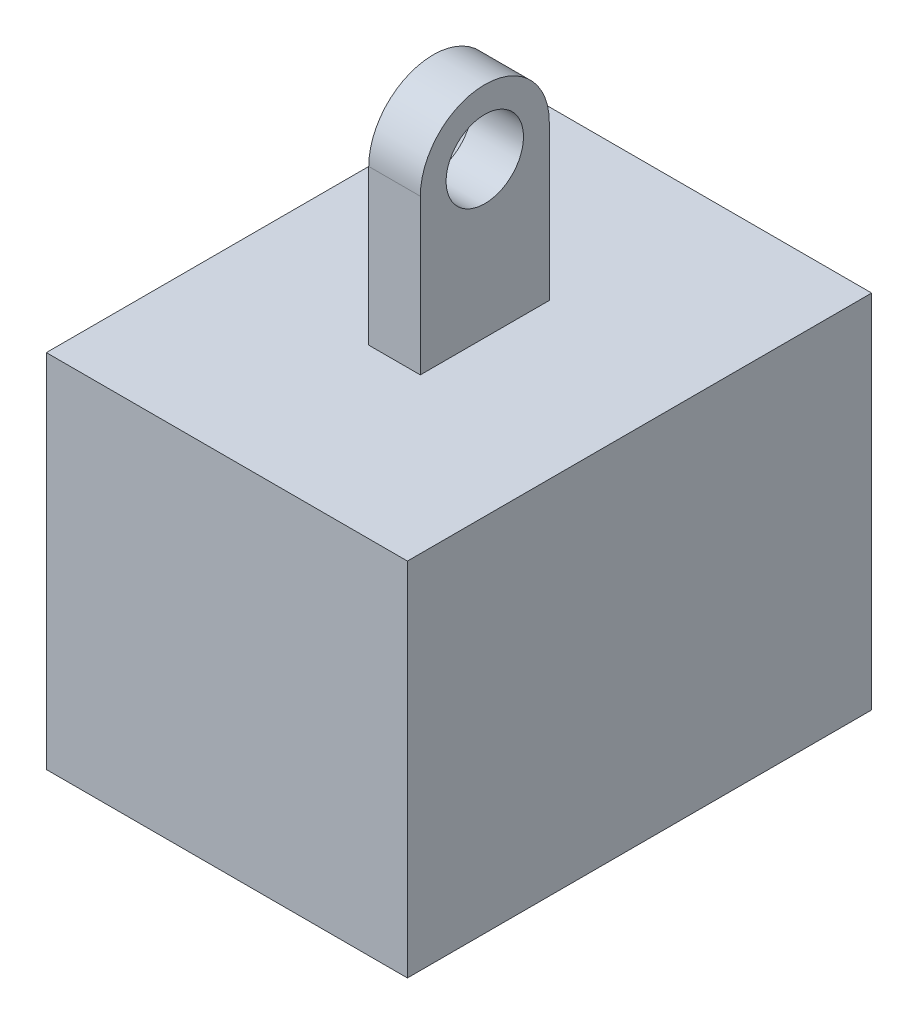
ISO-10303-21;
HEADER;
FILE_DESCRIPTION(('STEP AP214'),'2;1');
FILE_NAME('part.step','',(''),(''),'','','');
FILE_SCHEMA(('AUTOMOTIVE_DESIGN { 1 0 10303 214 1 1 1 1 }'));
ENDSEC;
DATA;
#1=APPLICATION_CONTEXT('core data for automotive mechanical design processes');
#2=APPLICATION_PROTOCOL_DEFINITION('international standard','automotive_design',2000,#1);
#3=PRODUCT_CONTEXT('',#1,'mechanical');
#4=PRODUCT('Part','Part','',(#3));
#5=PRODUCT_RELATED_PRODUCT_CATEGORY('part','',(#4));
#6=PRODUCT_DEFINITION_FORMATION('','',#4);
#7=PRODUCT_DEFINITION_CONTEXT('part definition',#1,'design');
#8=PRODUCT_DEFINITION('design','',#6,#7);
#9=PRODUCT_DEFINITION_SHAPE('','',#8);
#10=(LENGTH_UNIT() NAMED_UNIT(*) SI_UNIT(.MILLI.,.METRE.));
#11=(NAMED_UNIT(*) PLANE_ANGLE_UNIT() SI_UNIT($,.RADIAN.));
#12=(NAMED_UNIT(*) SI_UNIT($,.STERADIAN.) SOLID_ANGLE_UNIT());
#13=UNCERTAINTY_MEASURE_WITH_UNIT(LENGTH_MEASURE(1.E-05),#10,'distance_accuracy_value','');
#14=(GEOMETRIC_REPRESENTATION_CONTEXT(3) GLOBAL_UNCERTAINTY_ASSIGNED_CONTEXT((#13)) GLOBAL_UNIT_ASSIGNED_CONTEXT((#10,
#11,#12)) REPRESENTATION_CONTEXT('',''));
#15=CARTESIAN_POINT('',(0.,0.,0.));
#16=DIRECTION('',(0.,0.,1.));
#17=DIRECTION('',(1.,0.,0.));
#18=AXIS2_PLACEMENT_3D('',#15,#16,#17);
#19=CARTESIAN_POINT('',(35.,35.,90.));
#20=DIRECTION('',(-1.,0.,0.));
#21=DIRECTION('',(0.,-1.,0.));
#22=AXIS2_PLACEMENT_3D('',#19,#20,#21);
#23=PLANE('',#22);
#24=DIRECTION('',(0.,1.,0.));
#25=VECTOR('',#24,1.);
#26=CARTESIAN_POINT('',(35.,35.,0.));
#27=LINE('',#26,#25);
#28=CARTESIAN_POINT('',(35.,-35.,0.));
#29=VERTEX_POINT('',#28);
#30=CARTESIAN_POINT('',(35.,35.,0.));
#31=VERTEX_POINT('',#30);
#32=EDGE_CURVE('E138',#29,#31,#27,.T.);
#33=ORIENTED_EDGE('',*,*,#32,.T.);
#34=DIRECTION('',(0.,0.,-1.));
#35=VECTOR('',#34,1.);
#36=CARTESIAN_POINT('',(35.,35.,90.));
#37=LINE('',#36,#35);
#38=CARTESIAN_POINT('',(35.,35.,90.));
#39=VERTEX_POINT('',#38);
#40=EDGE_CURVE('E11',#39,#31,#37,.T.);
#41=ORIENTED_EDGE('',*,*,#40,.F.);
#42=DIRECTION('',(0.,1.,0.));
#43=VECTOR('',#42,1.);
#44=CARTESIAN_POINT('',(35.,35.,90.));
#45=LINE('',#44,#43);
#46=CARTESIAN_POINT('',(35.,-35.,90.));
#47=VERTEX_POINT('',#46);
#48=EDGE_CURVE('E142',#47,#39,#45,.T.);
#49=ORIENTED_EDGE('',*,*,#48,.F.);
#50=DIRECTION('',(0.,0.,-1.));
#51=VECTOR('',#50,1.);
#52=CARTESIAN_POINT('',(35.,-35.,90.));
#53=LINE('',#52,#51);
#54=EDGE_CURVE('E152',#47,#29,#53,.T.);
#55=ORIENTED_EDGE('',*,*,#54,.T.);
#56=EDGE_LOOP('',(#33,#41,#49,#55));
#57=FACE_BOUND('',#56,.T.);
#58=ADVANCED_FACE('F35',(#57),#23,.F.);
#59=CARTESIAN_POINT('',(-35.,35.,90.));
#60=DIRECTION('',(0.,-1.,0.));
#61=DIRECTION('',(0.,0.,-1.));
#62=AXIS2_PLACEMENT_3D('',#59,#60,#61);
#63=PLANE('',#62);
#64=DIRECTION('',(1.,0.,0.));
#65=VECTOR('',#64,1.);
#66=CARTESIAN_POINT('',(-5.,35.,57.5));
#67=LINE('',#66,#65);
#68=CARTESIAN_POINT('',(-5.,35.,57.5));
#69=VERTEX_POINT('',#68);
#70=CARTESIAN_POINT('',(5.,35.,57.5));
#71=VERTEX_POINT('',#70);
#72=EDGE_CURVE('E49',#69,#71,#67,.T.);
#73=ORIENTED_EDGE('',*,*,#72,.F.);
#74=DIRECTION('',(0.,0.,-1.));
#75=VECTOR('',#74,1.);
#76=CARTESIAN_POINT('',(-5.,35.,57.5));
#77=LINE('',#76,#75);
#78=CARTESIAN_POINT('',(-5.,35.,32.5));
#79=VERTEX_POINT('',#78);
#80=EDGE_CURVE('E53',#69,#79,#77,.T.);
#81=ORIENTED_EDGE('',*,*,#80,.T.);
#82=DIRECTION('',(1.,0.,0.));
#83=VECTOR('',#82,1.);
#84=CARTESIAN_POINT('',(-5.,35.,32.5));
#85=LINE('',#84,#83);
#86=CARTESIAN_POINT('',(5.,35.,32.5));
#87=VERTEX_POINT('',#86);
#88=EDGE_CURVE('E94',#79,#87,#85,.T.);
#89=ORIENTED_EDGE('',*,*,#88,.T.);
#90=DIRECTION('',(0.,0.,-1.));
#91=VECTOR('',#90,1.);
#92=CARTESIAN_POINT('',(5.,35.,57.5));
#93=LINE('',#92,#91);
#94=EDGE_CURVE('E99',#71,#87,#93,.T.);
#95=ORIENTED_EDGE('',*,*,#94,.F.);
#96=EDGE_LOOP('',(#73,#81,#89,#95));
#97=FACE_BOUND('',#96,.T.);
#98=DIRECTION('',(-1.,0.,0.));
#99=VECTOR('',#98,1.);
#100=CARTESIAN_POINT('',(-35.,35.,0.));
#101=LINE('',#100,#99);
#102=CARTESIAN_POINT('',(-35.,35.,0.));
#103=VERTEX_POINT('',#102);
#104=EDGE_CURVE('E155',#31,#103,#101,.T.);
#105=ORIENTED_EDGE('',*,*,#104,.T.);
#106=DIRECTION('',(0.,0.,-1.));
#107=VECTOR('',#106,1.);
#108=CARTESIAN_POINT('',(-35.,35.,90.));
#109=LINE('',#108,#107);
#110=CARTESIAN_POINT('',(-35.,35.,90.));
#111=VERTEX_POINT('',#110);
#112=EDGE_CURVE('E42',#111,#103,#109,.T.);
#113=ORIENTED_EDGE('',*,*,#112,.F.);
#114=DIRECTION('',(-1.,0.,0.));
#115=VECTOR('',#114,1.);
#116=CARTESIAN_POINT('',(-35.,35.,90.));
#117=LINE('',#116,#115);
#118=EDGE_CURVE('E145',#39,#111,#117,.T.);
#119=ORIENTED_EDGE('',*,*,#118,.F.);
#120=ORIENTED_EDGE('',*,*,#40,.T.);
#121=EDGE_LOOP('',(#105,#113,#119,#120));
#122=FACE_BOUND('',#121,.T.);
#123=ADVANCED_FACE('F96',(#97,#122),#63,.F.);
#124=CARTESIAN_POINT('',(-35.,35.,90.));
#125=DIRECTION('',(1.,0.,0.));
#126=DIRECTION('',(0.,1.,0.));
#127=AXIS2_PLACEMENT_3D('',#124,#125,#126);
#128=PLANE('',#127);
#129=DIRECTION('',(0.,-1.,0.));
#130=VECTOR('',#129,1.);
#131=CARTESIAN_POINT('',(-35.,35.,0.));
#132=LINE('',#131,#130);
#133=CARTESIAN_POINT('',(-35.,-35.,0.));
#134=VERTEX_POINT('',#133);
#135=EDGE_CURVE('E157',#103,#134,#132,.T.);
#136=ORIENTED_EDGE('',*,*,#135,.T.);
#137=DIRECTION('',(0.,0.,-1.));
#138=VECTOR('',#137,1.);
#139=CARTESIAN_POINT('',(-35.,-35.,90.));
#140=LINE('',#139,#138);
#141=CARTESIAN_POINT('',(-35.,-35.,90.));
#142=VERTEX_POINT('',#141);
#143=EDGE_CURVE('E162',#142,#134,#140,.T.);
#144=ORIENTED_EDGE('',*,*,#143,.F.);
#145=DIRECTION('',(0.,-1.,0.));
#146=VECTOR('',#145,1.);
#147=CARTESIAN_POINT('',(-35.,35.,90.));
#148=LINE('',#147,#146);
#149=EDGE_CURVE('E148',#111,#142,#148,.T.);
#150=ORIENTED_EDGE('',*,*,#149,.F.);
#151=ORIENTED_EDGE('',*,*,#112,.T.);
#152=EDGE_LOOP('',(#136,#144,#150,#151));
#153=FACE_BOUND('',#152,.T.);
#154=ADVANCED_FACE('F169',(#153),#128,.F.);
#155=CARTESIAN_POINT('',(-35.,-35.,90.));
#156=DIRECTION('',(0.,1.,0.));
#157=DIRECTION('',(0.,0.,1.));
#158=AXIS2_PLACEMENT_3D('',#155,#156,#157);
#159=PLANE('',#158);
#160=DIRECTION('',(1.,0.,0.));
#161=VECTOR('',#160,1.);
#162=CARTESIAN_POINT('',(-35.,-35.,0.));
#163=LINE('',#162,#161);
#164=EDGE_CURVE('E146',#134,#29,#163,.T.);
#165=ORIENTED_EDGE('',*,*,#164,.T.);
#166=ORIENTED_EDGE('',*,*,#54,.F.);
#167=DIRECTION('',(1.,0.,0.));
#168=VECTOR('',#167,1.);
#169=CARTESIAN_POINT('',(-35.,-35.,90.));
#170=LINE('',#169,#168);
#171=EDGE_CURVE('E150',#142,#47,#170,.T.);
#172=ORIENTED_EDGE('',*,*,#171,.F.);
#173=ORIENTED_EDGE('',*,*,#143,.T.);
#174=EDGE_LOOP('',(#165,#166,#172,#173));
#175=FACE_BOUND('',#174,.T.);
#176=ADVANCED_FACE('F177',(#175),#159,.F.);
#177=CARTESIAN_POINT('',(0.,0.,90.));
#178=DIRECTION('',(0.,0.,1.));
#179=DIRECTION('',(1.,0.,0.));
#180=AXIS2_PLACEMENT_3D('',#177,#178,#179);
#181=PLANE('',#180);
#182=ORIENTED_EDGE('',*,*,#48,.T.);
#183=ORIENTED_EDGE('',*,*,#118,.T.);
#184=ORIENTED_EDGE('',*,*,#149,.T.);
#185=ORIENTED_EDGE('',*,*,#171,.T.);
#186=EDGE_LOOP('',(#182,#183,#184,#185));
#187=FACE_BOUND('',#186,.T.);
#188=ADVANCED_FACE('F183',(#187),#181,.T.);
#189=CARTESIAN_POINT('',(0.,0.,0.));
#190=DIRECTION('',(0.,0.,1.));
#191=DIRECTION('',(1.,0.,0.));
#192=AXIS2_PLACEMENT_3D('',#189,#190,#191);
#193=PLANE('',#192);
#194=ORIENTED_EDGE('',*,*,#32,.F.);
#195=ORIENTED_EDGE('',*,*,#164,.F.);
#196=ORIENTED_EDGE('',*,*,#135,.F.);
#197=ORIENTED_EDGE('',*,*,#104,.F.);
#198=EDGE_LOOP('',(#194,#195,#196,#197));
#199=FACE_BOUND('',#198,.T.);
#200=ADVANCED_FACE('F174',(#199),#193,.F.);
#201=CARTESIAN_POINT('',(-5.,35.,57.5));
#202=DIRECTION('',(0.,0.,1.));
#203=DIRECTION('',(0.,-1.,0.));
#204=AXIS2_PLACEMENT_3D('',#201,#202,#203);
#205=PLANE('',#204);
#206=ORIENTED_EDGE('',*,*,#72,.T.);
#207=DIRECTION('',(0.,-1.,0.));
#208=VECTOR('',#207,1.);
#209=CARTESIAN_POINT('',(5.,35.,57.5));
#210=LINE('',#209,#208);
#211=CARTESIAN_POINT('',(5.,65.,57.5));
#212=VERTEX_POINT('',#211);
#213=EDGE_CURVE('E118',#212,#71,#210,.T.);
#214=ORIENTED_EDGE('',*,*,#213,.F.);
#215=DIRECTION('',(1.,0.,0.));
#216=VECTOR('',#215,1.);
#217=CARTESIAN_POINT('',(-5.,65.,57.5));
#218=LINE('',#217,#216);
#219=CARTESIAN_POINT('',(-5.,65.,57.5));
#220=VERTEX_POINT('',#219);
#221=EDGE_CURVE('E139',#220,#212,#218,.T.);
#222=ORIENTED_EDGE('',*,*,#221,.F.);
#223=DIRECTION('',(0.,-1.,0.));
#224=VECTOR('',#223,1.);
#225=CARTESIAN_POINT('',(-5.,35.,57.5));
#226=LINE('',#225,#224);
#227=EDGE_CURVE('E104',#220,#69,#226,.T.);
#228=ORIENTED_EDGE('',*,*,#227,.T.);
#229=EDGE_LOOP('',(#206,#214,#222,#228));
#230=FACE_BOUND('',#229,.T.);
#231=ADVANCED_FACE('F195',(#230),#205,.T.);
#232=CARTESIAN_POINT('',(-5.,65.,45.));
#233=DIRECTION('',(1.,0.,0.));
#234=DIRECTION('',(0.,0.,-1.));
#235=AXIS2_PLACEMENT_3D('',#232,#233,#234);
#236=CYLINDRICAL_SURFACE('',#235,12.5);
#237=ORIENTED_EDGE('',*,*,#221,.T.);
#238=CARTESIAN_POINT('',(5.,65.,45.));
#239=DIRECTION('',(1.,0.,0.));
#240=DIRECTION('',(0.,0.,1.));
#241=AXIS2_PLACEMENT_3D('',#238,#239,#240);
#242=CIRCLE('',#241,12.5);
#243=CARTESIAN_POINT('',(5.,65.,32.5));
#244=VERTEX_POINT('',#243);
#245=EDGE_CURVE('E112',#244,#212,#242,.T.);
#246=ORIENTED_EDGE('',*,*,#245,.F.);
#247=DIRECTION('',(1.,0.,0.));
#248=VECTOR('',#247,1.);
#249=CARTESIAN_POINT('',(-5.,65.,32.5));
#250=LINE('',#249,#248);
#251=CARTESIAN_POINT('',(-5.,65.,32.5));
#252=VERTEX_POINT('',#251);
#253=EDGE_CURVE('E103',#252,#244,#250,.T.);
#254=ORIENTED_EDGE('',*,*,#253,.F.);
#255=CARTESIAN_POINT('',(-5.,65.,45.));
#256=DIRECTION('',(1.,0.,0.));
#257=DIRECTION('',(0.,0.,1.));
#258=AXIS2_PLACEMENT_3D('',#255,#256,#257);
#259=CIRCLE('',#258,12.5);
#260=EDGE_CURVE('E132',#252,#220,#259,.T.);
#261=ORIENTED_EDGE('',*,*,#260,.T.);
#262=EDGE_LOOP('',(#237,#246,#254,#261));
#263=FACE_BOUND('',#262,.T.);
#264=ADVANCED_FACE('F201',(#263),#236,.T.);
#265=CARTESIAN_POINT('',(-5.,35.,32.5));
#266=DIRECTION('',(0.,0.,-1.));
#267=DIRECTION('',(-1.,0.,0.));
#268=AXIS2_PLACEMENT_3D('',#265,#266,#267);
#269=PLANE('',#268);
#270=ORIENTED_EDGE('',*,*,#253,.T.);
#271=DIRECTION('',(0.,1.,0.));
#272=VECTOR('',#271,1.);
#273=CARTESIAN_POINT('',(5.,35.,32.5));
#274=LINE('',#273,#272);
#275=EDGE_CURVE('E107',#87,#244,#274,.T.);
#276=ORIENTED_EDGE('',*,*,#275,.F.);
#277=ORIENTED_EDGE('',*,*,#88,.F.);
#278=DIRECTION('',(0.,1.,0.));
#279=VECTOR('',#278,1.);
#280=CARTESIAN_POINT('',(-5.,35.,32.5));
#281=LINE('',#280,#279);
#282=EDGE_CURVE('E130',#79,#252,#281,.T.);
#283=ORIENTED_EDGE('',*,*,#282,.T.);
#284=EDGE_LOOP('',(#270,#276,#277,#283));
#285=FACE_BOUND('',#284,.T.);
#286=ADVANCED_FACE('F108',(#285),#269,.T.);
#287=CARTESIAN_POINT('',(-5.,65.,45.));
#288=DIRECTION('',(-1.,0.,0.));
#289=DIRECTION('',(0.,0.,1.));
#290=AXIS2_PLACEMENT_3D('',#287,#288,#289);
#291=PLANE('',#290);
#292=CARTESIAN_POINT('',(-5.,65.,45.));
#293=DIRECTION('',(1.,0.,0.));
#294=DIRECTION('',(0.,0.,-1.));
#295=AXIS2_PLACEMENT_3D('',#292,#293,#294);
#296=CIRCLE('',#295,7.5);
#297=CARTESIAN_POINT('',(-5.,65.,37.5));
#298=VERTEX_POINT('',#297);
#299=EDGE_CURVE('E126',#298,#298,#296,.T.);
#300=ORIENTED_EDGE('',*,*,#299,.T.);
#301=EDGE_LOOP('',(#300));
#302=FACE_BOUND('',#301,.T.);
#303=ORIENTED_EDGE('',*,*,#80,.F.);
#304=ORIENTED_EDGE('',*,*,#227,.F.);
#305=ORIENTED_EDGE('',*,*,#260,.F.);
#306=ORIENTED_EDGE('',*,*,#282,.F.);
#307=EDGE_LOOP('',(#303,#304,#305,#306));
#308=FACE_BOUND('',#307,.T.);
#309=ADVANCED_FACE('F200',(#302,#308),#291,.T.);
#310=CARTESIAN_POINT('',(-5.,65.,45.));
#311=DIRECTION('',(1.,0.,0.));
#312=DIRECTION('',(0.,0.,-1.));
#313=AXIS2_PLACEMENT_3D('',#310,#311,#312);
#314=CYLINDRICAL_SURFACE('',#313,7.5);
#315=ORIENTED_EDGE('',*,*,#299,.F.);
#316=EDGE_LOOP('',(#315));
#317=FACE_BOUND('',#316,.T.);
#318=CARTESIAN_POINT('',(5.,65.,45.));
#319=DIRECTION('',(1.,0.,0.));
#320=DIRECTION('',(0.,0.,-1.));
#321=AXIS2_PLACEMENT_3D('',#318,#319,#320);
#322=CIRCLE('',#321,7.5);
#323=CARTESIAN_POINT('',(5.,65.,37.5));
#324=VERTEX_POINT('',#323);
#325=EDGE_CURVE('E119',#324,#324,#322,.T.);
#326=ORIENTED_EDGE('',*,*,#325,.T.);
#327=EDGE_LOOP('',(#326));
#328=FACE_BOUND('',#327,.T.);
#329=ADVANCED_FACE('F210',(#317,#328),#314,.F.);
#330=CARTESIAN_POINT('',(5.,65.,45.));
#331=DIRECTION('',(-1.,0.,0.));
#332=DIRECTION('',(0.,0.,1.));
#333=AXIS2_PLACEMENT_3D('',#330,#331,#332);
#334=PLANE('',#333);
#335=ORIENTED_EDGE('',*,*,#94,.T.);
#336=ORIENTED_EDGE('',*,*,#275,.T.);
#337=ORIENTED_EDGE('',*,*,#245,.T.);
#338=ORIENTED_EDGE('',*,*,#213,.T.);
#339=EDGE_LOOP('',(#335,#336,#337,#338));
#340=FACE_BOUND('',#339,.T.);
#341=ORIENTED_EDGE('',*,*,#325,.F.);
#342=EDGE_LOOP('',(#341));
#343=FACE_BOUND('',#342,.T.);
#344=ADVANCED_FACE('F115',(#340,#343),#334,.F.);
#345=CLOSED_SHELL('',(#58,#123,#154,#176,#188,#200,#231,#264,#286,#309,#329,#344));
#346=MANIFOLD_SOLID_BREP('B2',#345);
#347=ADVANCED_BREP_SHAPE_REPRESENTATION('',(#18,#346),#14);
#348=SHAPE_DEFINITION_REPRESENTATION(#9,#347);
ENDSEC;
END-ISO-10303-21;
